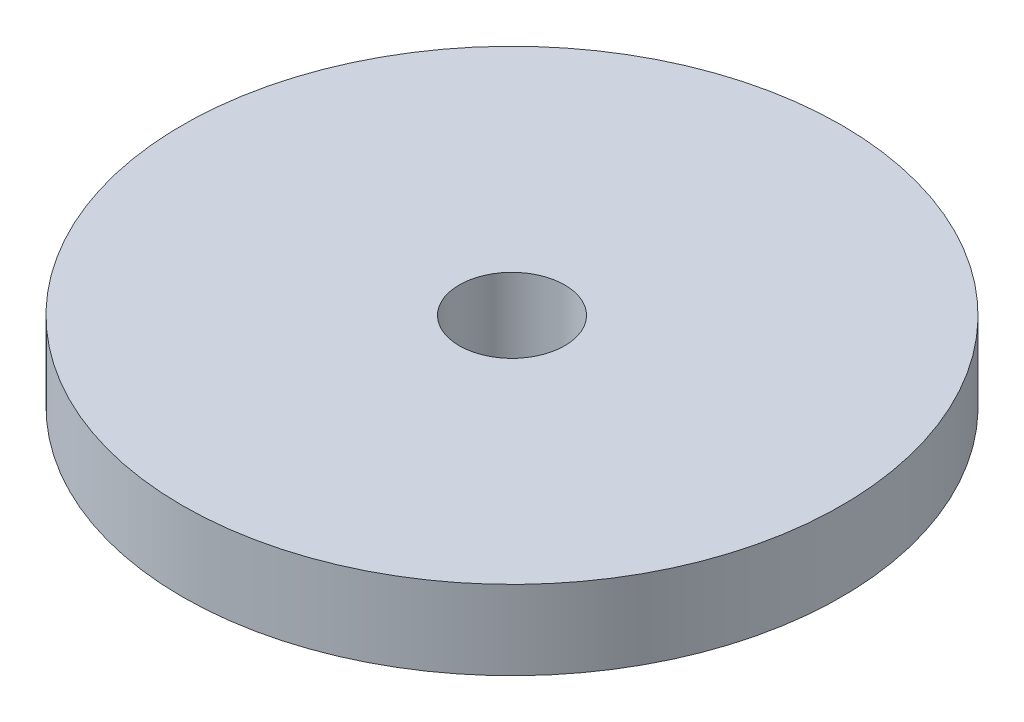
ISO-10303-21;
HEADER;
FILE_DESCRIPTION(('STEP AP214'),'2;1');
FILE_NAME('part.step','',(''),(''),'','','');
FILE_SCHEMA(('AUTOMOTIVE_DESIGN { 1 0 10303 214 1 1 1 1 }'));
ENDSEC;
DATA;
#1=APPLICATION_CONTEXT('core data for automotive mechanical design processes');
#2=APPLICATION_PROTOCOL_DEFINITION('international standard','automotive_design',2000,#1);
#3=PRODUCT_CONTEXT('',#1,'mechanical');
#4=PRODUCT('Part','Part','',(#3));
#5=PRODUCT_RELATED_PRODUCT_CATEGORY('part','',(#4));
#6=PRODUCT_DEFINITION_FORMATION('','',#4);
#7=PRODUCT_DEFINITION_CONTEXT('part definition',#1,'design');
#8=PRODUCT_DEFINITION('design','',#6,#7);
#9=PRODUCT_DEFINITION_SHAPE('','',#8);
#10=(LENGTH_UNIT() NAMED_UNIT(*) SI_UNIT(.MILLI.,.METRE.));
#11=(NAMED_UNIT(*) PLANE_ANGLE_UNIT() SI_UNIT($,.RADIAN.));
#12=(NAMED_UNIT(*) SI_UNIT($,.STERADIAN.) SOLID_ANGLE_UNIT());
#13=UNCERTAINTY_MEASURE_WITH_UNIT(LENGTH_MEASURE(1.E-05),#10,'distance_accuracy_value','');
#14=(GEOMETRIC_REPRESENTATION_CONTEXT(3) GLOBAL_UNCERTAINTY_ASSIGNED_CONTEXT((#13)) GLOBAL_UNIT_ASSIGNED_CONTEXT((#10,
#11,#12)) REPRESENTATION_CONTEXT('',''));
#15=CARTESIAN_POINT('',(0.,0.,0.));
#16=DIRECTION('',(0.,0.,1.));
#17=DIRECTION('',(1.,0.,0.));
#18=AXIS2_PLACEMENT_3D('',#15,#16,#17);
#19=CARTESIAN_POINT('',(0.,3.,0.));
#20=DIRECTION('',(0.,1.,0.));
#21=DIRECTION('',(0.,0.,1.));
#22=AXIS2_PLACEMENT_3D('',#19,#20,#21);
#23=PLANE('',#22);
#24=CARTESIAN_POINT('',(0.,3.,0.));
#25=DIRECTION('',(0.,1.,0.));
#26=DIRECTION('',(0.,0.,1.));
#27=AXIS2_PLACEMENT_3D('',#24,#25,#26);
#28=CIRCLE('',#27,12.5);
#29=CARTESIAN_POINT('',(0.,3.,12.5));
#30=VERTEX_POINT('',#29);
#31=EDGE_CURVE('E10',#30,#30,#28,.T.);
#32=ORIENTED_EDGE('',*,*,#31,.T.);
#33=EDGE_LOOP('',(#32));
#34=FACE_BOUND('',#33,.T.);
#35=CARTESIAN_POINT('',(0.,3.,0.));
#36=DIRECTION('',(0.,1.,0.));
#37=DIRECTION('',(0.,0.,1.));
#38=AXIS2_PLACEMENT_3D('',#35,#36,#37);
#39=CIRCLE('',#38,2.);
#40=CARTESIAN_POINT('',(0.,3.,2.));
#41=VERTEX_POINT('',#40);
#42=EDGE_CURVE('E50',#41,#41,#39,.T.);
#43=ORIENTED_EDGE('',*,*,#42,.F.);
#44=EDGE_LOOP('',(#43));
#45=FACE_BOUND('',#44,.T.);
#46=ADVANCED_FACE('F37',(#34,#45),#23,.T.);
#47=CARTESIAN_POINT('',(0.,0.,0.));
#48=DIRECTION('',(0.,1.,0.));
#49=DIRECTION('',(0.,0.,1.));
#50=AXIS2_PLACEMENT_3D('',#47,#48,#49);
#51=PLANE('',#50);
#52=CARTESIAN_POINT('',(0.,0.,0.));
#53=DIRECTION('',(0.,1.,0.));
#54=DIRECTION('',(0.,0.,1.));
#55=AXIS2_PLACEMENT_3D('',#52,#53,#54);
#56=CIRCLE('',#55,12.5);
#57=CARTESIAN_POINT('',(0.,0.,12.5));
#58=VERTEX_POINT('',#57);
#59=EDGE_CURVE('E41',#58,#58,#56,.T.);
#60=ORIENTED_EDGE('',*,*,#59,.F.);
#61=EDGE_LOOP('',(#60));
#62=FACE_BOUND('',#61,.T.);
#63=CARTESIAN_POINT('',(0.,0.,0.));
#64=DIRECTION('',(0.,1.,0.));
#65=DIRECTION('',(0.,0.,1.));
#66=AXIS2_PLACEMENT_3D('',#63,#64,#65);
#67=CIRCLE('',#66,2.);
#68=CARTESIAN_POINT('',(0.,0.,2.));
#69=VERTEX_POINT('',#68);
#70=EDGE_CURVE('E52',#69,#69,#67,.T.);
#71=ORIENTED_EDGE('',*,*,#70,.T.);
#72=EDGE_LOOP('',(#71));
#73=FACE_BOUND('',#72,.T.);
#74=ADVANCED_FACE('F64',(#62,#73),#51,.F.);
#75=CARTESIAN_POINT('',(0.,3.,0.));
#76=DIRECTION('',(0.,-1.,0.));
#77=DIRECTION('',(0.,0.,-1.));
#78=AXIS2_PLACEMENT_3D('',#75,#76,#77);
#79=CYLINDRICAL_SURFACE('',#78,12.5);
#80=ORIENTED_EDGE('',*,*,#31,.F.);
#81=EDGE_LOOP('',(#80));
#82=FACE_BOUND('',#81,.T.);
#83=ORIENTED_EDGE('',*,*,#59,.T.);
#84=EDGE_LOOP('',(#83));
#85=FACE_BOUND('',#84,.T.);
#86=ADVANCED_FACE('F39',(#82,#85),#79,.T.);
#87=CARTESIAN_POINT('',(0.,3.,0.));
#88=DIRECTION('',(0.,-1.,0.));
#89=DIRECTION('',(0.,0.,-1.));
#90=AXIS2_PLACEMENT_3D('',#87,#88,#89);
#91=CYLINDRICAL_SURFACE('',#90,2.);
#92=ORIENTED_EDGE('',*,*,#42,.T.);
#93=EDGE_LOOP('',(#92));
#94=FACE_BOUND('',#93,.T.);
#95=ORIENTED_EDGE('',*,*,#70,.F.);
#96=EDGE_LOOP('',(#95));
#97=FACE_BOUND('',#96,.T.);
#98=ADVANCED_FACE('F60',(#94,#97),#91,.F.);
#99=CLOSED_SHELL('',(#46,#74,#86,#98));
#100=MANIFOLD_SOLID_BREP('B2',#99);
#101=ADVANCED_BREP_SHAPE_REPRESENTATION('',(#18,#100),#14);
#102=SHAPE_DEFINITION_REPRESENTATION(#9,#101);
ENDSEC;
END-ISO-10303-21;
